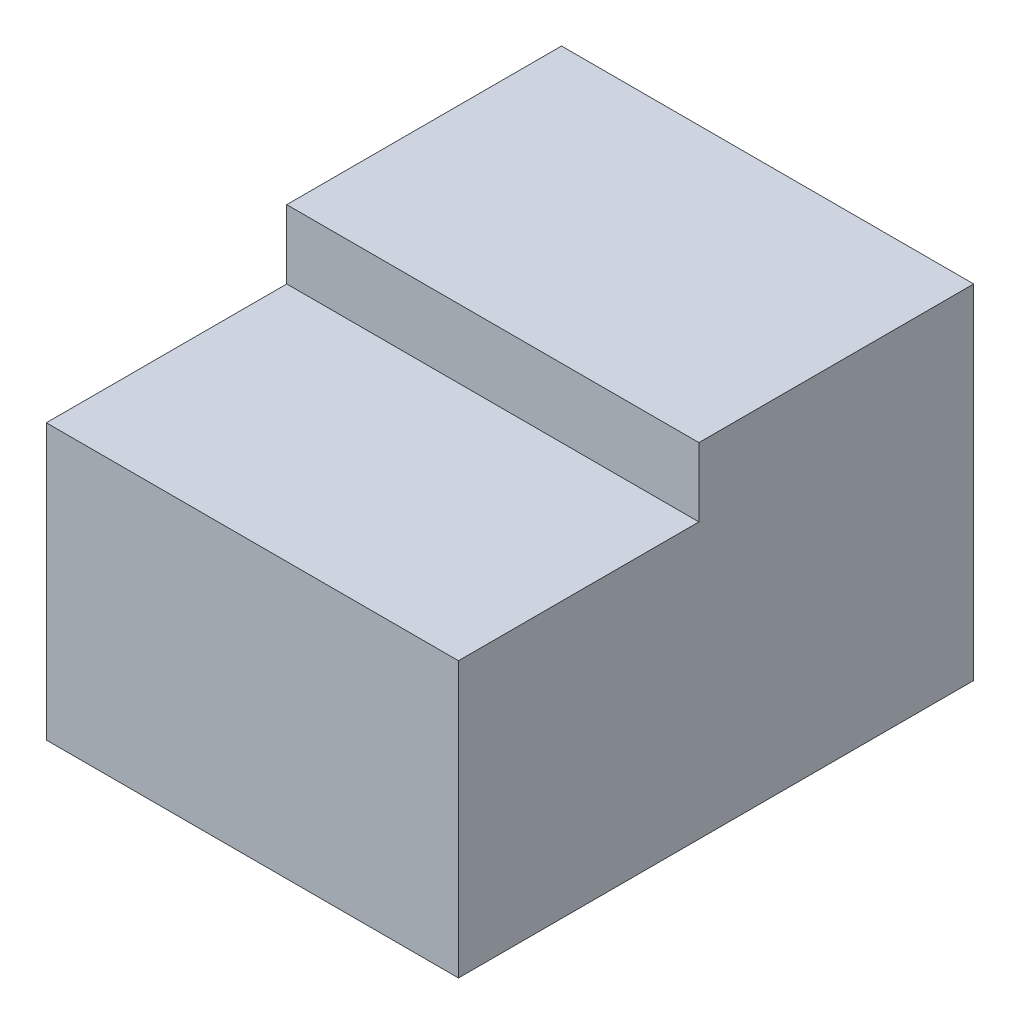
ISO-10303-21;
HEADER;
FILE_DESCRIPTION(('STEP AP214'),'2;1');
FILE_NAME('part.step','',(''),(''),'','','');
FILE_SCHEMA(('AUTOMOTIVE_DESIGN { 1 0 10303 214 1 1 1 1 }'));
ENDSEC;
DATA;
#1=APPLICATION_CONTEXT('core data for automotive mechanical design processes');
#2=APPLICATION_PROTOCOL_DEFINITION('international standard','automotive_design',2000,#1);
#3=PRODUCT_CONTEXT('',#1,'mechanical');
#4=PRODUCT('Part','Part','',(#3));
#5=PRODUCT_RELATED_PRODUCT_CATEGORY('part','',(#4));
#6=PRODUCT_DEFINITION_FORMATION('','',#4);
#7=PRODUCT_DEFINITION_CONTEXT('part definition',#1,'design');
#8=PRODUCT_DEFINITION('design','',#6,#7);
#9=PRODUCT_DEFINITION_SHAPE('','',#8);
#10=(LENGTH_UNIT() NAMED_UNIT(*) SI_UNIT(.MILLI.,.METRE.));
#11=(NAMED_UNIT(*) PLANE_ANGLE_UNIT() SI_UNIT($,.RADIAN.));
#12=(NAMED_UNIT(*) SI_UNIT($,.STERADIAN.) SOLID_ANGLE_UNIT());
#13=UNCERTAINTY_MEASURE_WITH_UNIT(LENGTH_MEASURE(1.E-05),#10,'distance_accuracy_value','');
#14=(GEOMETRIC_REPRESENTATION_CONTEXT(3) GLOBAL_UNCERTAINTY_ASSIGNED_CONTEXT((#13)) GLOBAL_UNIT_ASSIGNED_CONTEXT((#10,
#11,#12)) REPRESENTATION_CONTEXT('',''));
#15=CARTESIAN_POINT('',(0.,0.,0.));
#16=DIRECTION('',(0.,0.,1.));
#17=DIRECTION('',(1.,0.,0.));
#18=AXIS2_PLACEMENT_3D('',#15,#16,#17);
#19=CARTESIAN_POINT('',(12.,10.,0.));
#20=DIRECTION('',(0.,0.,-1.));
#21=DIRECTION('',(0.,1.,0.));
#22=AXIS2_PLACEMENT_3D('',#19,#20,#21);
#23=PLANE('',#22);
#24=DIRECTION('',(-0.5,-0.866025403784438,0.));
#25=VECTOR('',#24,1.);
#26=CARTESIAN_POINT('',(10.618802153517,5.,0.));
#27=LINE('',#26,#25);
#28=CARTESIAN_POINT('',(10.618802153517,5.,0.));
#29=VERTEX_POINT('',#28);
#30=CARTESIAN_POINT('',(8.3094010767585,1.,0.));
#31=VERTEX_POINT('',#30);
#32=EDGE_CURVE('E57',#29,#31,#27,.T.);
#33=ORIENTED_EDGE('',*,*,#32,.F.);
#34=DIRECTION('',(0.5,-0.866025403784439,0.));
#35=VECTOR('',#34,1.);
#36=CARTESIAN_POINT('',(8.3094010767585,9.,0.));
#37=LINE('',#36,#35);
#38=CARTESIAN_POINT('',(8.3094010767585,9.,0.));
#39=VERTEX_POINT('',#38);
#40=EDGE_CURVE('E216',#39,#29,#37,.T.);
#41=ORIENTED_EDGE('',*,*,#40,.F.);
#42=DIRECTION('',(1.,0.,0.));
#43=VECTOR('',#42,1.);
#44=CARTESIAN_POINT('',(3.6905989232415,9.,0.));
#45=LINE('',#44,#43);
#46=CARTESIAN_POINT('',(3.6905989232415,9.,0.));
#47=VERTEX_POINT('',#46);
#48=EDGE_CURVE('E242',#47,#39,#45,.T.);
#49=ORIENTED_EDGE('',*,*,#48,.F.);
#50=DIRECTION('',(0.5,0.866025403784439,0.));
#51=VECTOR('',#50,1.);
#52=CARTESIAN_POINT('',(1.38119784648299,5.,0.));
#53=LINE('',#52,#51);
#54=CARTESIAN_POINT('',(1.38119784648299,5.,0.));
#55=VERTEX_POINT('',#54);
#56=EDGE_CURVE('E239',#55,#47,#53,.T.);
#57=ORIENTED_EDGE('',*,*,#56,.F.);
#58=DIRECTION('',(-0.5,0.866025403784439,0.));
#59=VECTOR('',#58,1.);
#60=CARTESIAN_POINT('',(3.6905989232415,1.,0.));
#61=LINE('',#60,#59);
#62=CARTESIAN_POINT('',(3.6905989232415,1.,0.));
#63=VERTEX_POINT('',#62);
#64=EDGE_CURVE('E236',#63,#55,#61,.T.);
#65=ORIENTED_EDGE('',*,*,#64,.F.);
#66=DIRECTION('',(-1.,0.,0.));
#67=VECTOR('',#66,1.);
#68=CARTESIAN_POINT('',(8.3094010767585,1.,0.));
#69=LINE('',#68,#67);
#70=EDGE_CURVE('E233',#31,#63,#69,.T.);
#71=ORIENTED_EDGE('',*,*,#70,.F.);
#72=EDGE_LOOP('',(#33,#41,#49,#57,#65,#71));
#73=FACE_BOUND('',#72,.T.);
#74=DIRECTION('',(0.,-1.,0.));
#75=VECTOR('',#74,1.);
#76=CARTESIAN_POINT('',(0.,10.,0.));
#77=LINE('',#76,#75);
#78=CARTESIAN_POINT('',(0.,10.,0.));
#79=VERTEX_POINT('',#78);
#80=CARTESIAN_POINT('',(0.,0.,0.));
#81=VERTEX_POINT('',#80);
#82=EDGE_CURVE('E249',#79,#81,#77,.T.);
#83=ORIENTED_EDGE('',*,*,#82,.F.);
#84=DIRECTION('',(-1.,0.,0.));
#85=VECTOR('',#84,1.);
#86=CARTESIAN_POINT('',(12.,10.,0.));
#87=LINE('',#86,#85);
#88=CARTESIAN_POINT('',(12.,10.,0.));
#89=VERTEX_POINT('',#88);
#90=EDGE_CURVE('E11',#89,#79,#87,.T.);
#91=ORIENTED_EDGE('',*,*,#90,.F.);
#92=DIRECTION('',(0.,-1.,0.));
#93=VECTOR('',#92,1.);
#94=CARTESIAN_POINT('',(12.,10.,0.));
#95=LINE('',#94,#93);
#96=CARTESIAN_POINT('',(12.,0.,0.));
#97=VERTEX_POINT('',#96);
#98=EDGE_CURVE('E259',#89,#97,#95,.T.);
#99=ORIENTED_EDGE('',*,*,#98,.T.);
#100=DIRECTION('',(-1.,0.,0.));
#101=VECTOR('',#100,1.);
#102=CARTESIAN_POINT('',(12.,0.,0.));
#103=LINE('',#102,#101);
#104=EDGE_CURVE('E36',#97,#81,#103,.T.);
#105=ORIENTED_EDGE('',*,*,#104,.T.);
#106=EDGE_LOOP('',(#83,#91,#99,#105));
#107=FACE_BOUND('',#106,.T.);
#108=ADVANCED_FACE('F33',(#73,#107),#23,.T.);
#109=CARTESIAN_POINT('',(12.,10.,8.));
#110=DIRECTION('',(0.,1.,0.));
#111=DIRECTION('',(0.,0.,1.));
#112=AXIS2_PLACEMENT_3D('',#109,#110,#111);
#113=PLANE('',#112);
#114=DIRECTION('',(0.,0.,-1.));
#115=VECTOR('',#114,1.);
#116=CARTESIAN_POINT('',(0.,10.,8.));
#117=LINE('',#116,#115);
#118=CARTESIAN_POINT('',(0.,10.,8.));
#119=VERTEX_POINT('',#118);
#120=EDGE_CURVE('E263',#119,#79,#117,.T.);
#121=ORIENTED_EDGE('',*,*,#120,.F.);
#122=DIRECTION('',(-1.,0.,0.));
#123=VECTOR('',#122,1.);
#124=CARTESIAN_POINT('',(12.,10.,8.));
#125=LINE('',#124,#123);
#126=CARTESIAN_POINT('',(12.,10.,8.));
#127=VERTEX_POINT('',#126);
#128=EDGE_CURVE('E41',#127,#119,#125,.T.);
#129=ORIENTED_EDGE('',*,*,#128,.F.);
#130=DIRECTION('',(0.,0.,-1.));
#131=VECTOR('',#130,1.);
#132=CARTESIAN_POINT('',(12.,10.,8.));
#133=LINE('',#132,#131);
#134=EDGE_CURVE('E275',#127,#89,#133,.T.);
#135=ORIENTED_EDGE('',*,*,#134,.T.);
#136=ORIENTED_EDGE('',*,*,#90,.T.);
#137=EDGE_LOOP('',(#121,#129,#135,#136));
#138=FACE_BOUND('',#137,.T.);
#139=ADVANCED_FACE('F312',(#138),#113,.T.);
#140=CARTESIAN_POINT('',(12.,8.,8.));
#141=DIRECTION('',(0.,0.,1.));
#142=DIRECTION('',(1.,0.,0.));
#143=AXIS2_PLACEMENT_3D('',#140,#141,#142);
#144=PLANE('',#143);
#145=DIRECTION('',(0.,1.,0.));
#146=VECTOR('',#145,1.);
#147=CARTESIAN_POINT('',(0.,8.,8.));
#148=LINE('',#147,#146);
#149=CARTESIAN_POINT('',(0.,8.,8.));
#150=VERTEX_POINT('',#149);
#151=EDGE_CURVE('E289',#150,#119,#148,.T.);
#152=ORIENTED_EDGE('',*,*,#151,.F.);
#153=DIRECTION('',(-1.,0.,0.));
#154=VECTOR('',#153,1.);
#155=CARTESIAN_POINT('',(12.,8.,8.));
#156=LINE('',#155,#154);
#157=CARTESIAN_POINT('',(12.,8.,8.));
#158=VERTEX_POINT('',#157);
#159=EDGE_CURVE('E295',#158,#150,#156,.T.);
#160=ORIENTED_EDGE('',*,*,#159,.F.);
#161=DIRECTION('',(0.,1.,0.));
#162=VECTOR('',#161,1.);
#163=CARTESIAN_POINT('',(12.,8.,8.));
#164=LINE('',#163,#162);
#165=EDGE_CURVE('E272',#158,#127,#164,.T.);
#166=ORIENTED_EDGE('',*,*,#165,.T.);
#167=ORIENTED_EDGE('',*,*,#128,.T.);
#168=EDGE_LOOP('',(#152,#160,#166,#167));
#169=FACE_BOUND('',#168,.T.);
#170=ADVANCED_FACE('F325',(#169),#144,.T.);
#171=CARTESIAN_POINT('',(12.,8.,15.));
#172=DIRECTION('',(0.,1.,0.));
#173=DIRECTION('',(0.,0.,1.));
#174=AXIS2_PLACEMENT_3D('',#171,#172,#173);
#175=PLANE('',#174);
#176=DIRECTION('',(0.,0.,-1.));
#177=VECTOR('',#176,1.);
#178=CARTESIAN_POINT('',(0.,8.,15.));
#179=LINE('',#178,#177);
#180=CARTESIAN_POINT('',(0.,8.,15.));
#181=VERTEX_POINT('',#180);
#182=EDGE_CURVE('E286',#181,#150,#179,.T.);
#183=ORIENTED_EDGE('',*,*,#182,.F.);
#184=DIRECTION('',(-1.,0.,0.));
#185=VECTOR('',#184,1.);
#186=CARTESIAN_POINT('',(12.,8.,15.));
#187=LINE('',#186,#185);
#188=CARTESIAN_POINT('',(12.,8.,15.));
#189=VERTEX_POINT('',#188);
#190=EDGE_CURVE('E297',#189,#181,#187,.T.);
#191=ORIENTED_EDGE('',*,*,#190,.F.);
#192=DIRECTION('',(0.,0.,-1.));
#193=VECTOR('',#192,1.);
#194=CARTESIAN_POINT('',(12.,8.,15.));
#195=LINE('',#194,#193);
#196=EDGE_CURVE('E269',#189,#158,#195,.T.);
#197=ORIENTED_EDGE('',*,*,#196,.T.);
#198=ORIENTED_EDGE('',*,*,#159,.T.);
#199=EDGE_LOOP('',(#183,#191,#197,#198));
#200=FACE_BOUND('',#199,.T.);
#201=ADVANCED_FACE('F323',(#200),#175,.T.);
#202=CARTESIAN_POINT('',(12.,0.,15.));
#203=DIRECTION('',(0.,0.,1.));
#204=DIRECTION('',(1.,0.,0.));
#205=AXIS2_PLACEMENT_3D('',#202,#203,#204);
#206=PLANE('',#205);
#207=DIRECTION('',(0.,1.,0.));
#208=VECTOR('',#207,1.);
#209=CARTESIAN_POINT('',(0.,0.,15.));
#210=LINE('',#209,#208);
#211=CARTESIAN_POINT('',(0.,0.,15.));
#212=VERTEX_POINT('',#211);
#213=EDGE_CURVE('E283',#212,#181,#210,.T.);
#214=ORIENTED_EDGE('',*,*,#213,.F.);
#215=DIRECTION('',(-1.,0.,0.));
#216=VECTOR('',#215,1.);
#217=CARTESIAN_POINT('',(12.,0.,15.));
#218=LINE('',#217,#216);
#219=CARTESIAN_POINT('',(12.,0.,15.));
#220=VERTEX_POINT('',#219);
#221=EDGE_CURVE('E298',#220,#212,#218,.T.);
#222=ORIENTED_EDGE('',*,*,#221,.F.);
#223=DIRECTION('',(0.,1.,0.));
#224=VECTOR('',#223,1.);
#225=CARTESIAN_POINT('',(12.,0.,15.));
#226=LINE('',#225,#224);
#227=EDGE_CURVE('E266',#220,#189,#226,.T.);
#228=ORIENTED_EDGE('',*,*,#227,.T.);
#229=ORIENTED_EDGE('',*,*,#190,.T.);
#230=EDGE_LOOP('',(#214,#222,#228,#229));
#231=FACE_BOUND('',#230,.T.);
#232=ADVANCED_FACE('F320',(#231),#206,.T.);
#233=CARTESIAN_POINT('',(12.,0.,0.));
#234=DIRECTION('',(0.,-1.,0.));
#235=DIRECTION('',(0.,0.,-1.));
#236=AXIS2_PLACEMENT_3D('',#233,#234,#235);
#237=PLANE('',#236);
#238=DIRECTION('',(-0.5,0.,-0.866025403784438));
#239=VECTOR('',#238,1.);
#240=CARTESIAN_POINT('',(3.6905989232415,0.,14.));
#241=LINE('',#240,#239);
#242=CARTESIAN_POINT('',(3.6905989232415,0.,14.));
#243=VERTEX_POINT('',#242);
#244=CARTESIAN_POINT('',(1.38119784648299,0.,10.));
#245=VERTEX_POINT('',#244);
#246=EDGE_CURVE('E49',#243,#245,#241,.T.);
#247=ORIENTED_EDGE('',*,*,#246,.F.);
#248=DIRECTION('',(-1.,0.,0.));
#249=VECTOR('',#248,1.);
#250=CARTESIAN_POINT('',(8.3094010767585,0.,14.));
#251=LINE('',#250,#249);
#252=CARTESIAN_POINT('',(8.3094010767585,0.,14.));
#253=VERTEX_POINT('',#252);
#254=EDGE_CURVE('E179',#253,#243,#251,.T.);
#255=ORIENTED_EDGE('',*,*,#254,.F.);
#256=DIRECTION('',(-0.5,0.,0.866025403784438));
#257=VECTOR('',#256,1.);
#258=CARTESIAN_POINT('',(10.618802153517,0.,10.));
#259=LINE('',#258,#257);
#260=CARTESIAN_POINT('',(10.618802153517,0.,10.));
#261=VERTEX_POINT('',#260);
#262=EDGE_CURVE('E182',#261,#253,#259,.T.);
#263=ORIENTED_EDGE('',*,*,#262,.F.);
#264=DIRECTION('',(0.5,0.,0.866025403784438));
#265=VECTOR('',#264,1.);
#266=CARTESIAN_POINT('',(8.3094010767585,0.,6.));
#267=LINE('',#266,#265);
#268=CARTESIAN_POINT('',(8.3094010767585,0.,6.));
#269=VERTEX_POINT('',#268);
#270=EDGE_CURVE('E198',#269,#261,#267,.T.);
#271=ORIENTED_EDGE('',*,*,#270,.F.);
#272=DIRECTION('',(1.,0.,0.));
#273=VECTOR('',#272,1.);
#274=CARTESIAN_POINT('',(3.6905989232415,0.,6.));
#275=LINE('',#274,#273);
#276=CARTESIAN_POINT('',(3.6905989232415,0.,6.));
#277=VERTEX_POINT('',#276);
#278=EDGE_CURVE('E195',#277,#269,#275,.T.);
#279=ORIENTED_EDGE('',*,*,#278,.F.);
#280=DIRECTION('',(0.500000000000001,0.,-0.866025403784438));
#281=VECTOR('',#280,1.);
#282=CARTESIAN_POINT('',(1.38119784648299,0.,10.));
#283=LINE('',#282,#281);
#284=EDGE_CURVE('E193',#245,#277,#283,.T.);
#285=ORIENTED_EDGE('',*,*,#284,.F.);
#286=EDGE_LOOP('',(#247,#255,#263,#271,#279,#285));
#287=FACE_BOUND('',#286,.T.);
#288=DIRECTION('',(0.,0.,1.));
#289=VECTOR('',#288,1.);
#290=CARTESIAN_POINT('',(0.,0.,0.));
#291=LINE('',#290,#289);
#292=EDGE_CURVE('E280',#81,#212,#291,.T.);
#293=ORIENTED_EDGE('',*,*,#292,.F.);
#294=ORIENTED_EDGE('',*,*,#104,.F.);
#295=DIRECTION('',(0.,0.,1.));
#296=VECTOR('',#295,1.);
#297=CARTESIAN_POINT('',(12.,0.,0.));
#298=LINE('',#297,#296);
#299=EDGE_CURVE('E262',#97,#220,#298,.T.);
#300=ORIENTED_EDGE('',*,*,#299,.T.);
#301=ORIENTED_EDGE('',*,*,#221,.T.);
#302=EDGE_LOOP('',(#293,#294,#300,#301));
#303=FACE_BOUND('',#302,.T.);
#304=ADVANCED_FACE('F306',(#287,#303),#237,.T.);
#305=CARTESIAN_POINT('',(12.,0.,0.));
#306=DIRECTION('',(-1.,0.,0.));
#307=DIRECTION('',(0.,0.,1.));
#308=AXIS2_PLACEMENT_3D('',#305,#306,#307);
#309=PLANE('',#308);
#310=ORIENTED_EDGE('',*,*,#98,.F.);
#311=ORIENTED_EDGE('',*,*,#134,.F.);
#312=ORIENTED_EDGE('',*,*,#165,.F.);
#313=ORIENTED_EDGE('',*,*,#196,.F.);
#314=ORIENTED_EDGE('',*,*,#227,.F.);
#315=ORIENTED_EDGE('',*,*,#299,.F.);
#316=EDGE_LOOP('',(#310,#311,#312,#313,#314,#315));
#317=FACE_BOUND('',#316,.T.);
#318=ADVANCED_FACE('F315',(#317),#309,.F.);
#319=CARTESIAN_POINT('',(0.,0.,0.));
#320=DIRECTION('',(-1.,0.,0.));
#321=DIRECTION('',(0.,0.,1.));
#322=AXIS2_PLACEMENT_3D('',#319,#320,#321);
#323=PLANE('',#322);
#324=ORIENTED_EDGE('',*,*,#82,.T.);
#325=ORIENTED_EDGE('',*,*,#292,.T.);
#326=ORIENTED_EDGE('',*,*,#213,.T.);
#327=ORIENTED_EDGE('',*,*,#182,.T.);
#328=ORIENTED_EDGE('',*,*,#151,.T.);
#329=ORIENTED_EDGE('',*,*,#120,.T.);
#330=EDGE_LOOP('',(#324,#325,#326,#327,#328,#329));
#331=FACE_BOUND('',#330,.T.);
#332=ADVANCED_FACE('F308',(#331),#323,.T.);
#333=CARTESIAN_POINT('',(10.618802153517,5.,5.));
#334=DIRECTION('',(0.866025403784438,-0.5,0.));
#335=DIRECTION('',(0.5,0.866025403784438,0.));
#336=AXIS2_PLACEMENT_3D('',#333,#334,#335);
#337=PLANE('',#336);
#338=ORIENTED_EDGE('',*,*,#32,.T.);
#339=DIRECTION('',(0.,0.,-1.));
#340=VECTOR('',#339,1.);
#341=CARTESIAN_POINT('',(8.3094010767585,1.,5.));
#342=LINE('',#341,#340);
#343=CARTESIAN_POINT('',(8.3094010767585,1.,5.));
#344=VERTEX_POINT('',#343);
#345=EDGE_CURVE('E231',#344,#31,#342,.T.);
#346=ORIENTED_EDGE('',*,*,#345,.F.);
#347=DIRECTION('',(-0.5,-0.866025403784438,0.));
#348=VECTOR('',#347,1.);
#349=CARTESIAN_POINT('',(10.618802153517,5.,5.));
#350=LINE('',#349,#348);
#351=CARTESIAN_POINT('',(10.618802153517,5.,5.));
#352=VERTEX_POINT('',#351);
#353=EDGE_CURVE('E212',#352,#344,#350,.T.);
#354=ORIENTED_EDGE('',*,*,#353,.F.);
#355=DIRECTION('',(0.,0.,-1.));
#356=VECTOR('',#355,1.);
#357=CARTESIAN_POINT('',(10.618802153517,5.,5.));
#358=LINE('',#357,#356);
#359=EDGE_CURVE('E247',#352,#29,#358,.T.);
#360=ORIENTED_EDGE('',*,*,#359,.T.);
#361=EDGE_LOOP('',(#338,#346,#354,#360));
#362=FACE_BOUND('',#361,.T.);
#363=ADVANCED_FACE('F348',(#362),#337,.F.);
#364=CARTESIAN_POINT('',(8.3094010767585,9.,5.));
#365=DIRECTION('',(0.866025403784439,0.5,0.));
#366=DIRECTION('',(-0.5,0.866025403784439,0.));
#367=AXIS2_PLACEMENT_3D('',#364,#365,#366);
#368=PLANE('',#367);
#369=ORIENTED_EDGE('',*,*,#40,.T.);
#370=ORIENTED_EDGE('',*,*,#359,.F.);
#371=DIRECTION('',(0.5,-0.866025403784439,0.));
#372=VECTOR('',#371,1.);
#373=CARTESIAN_POINT('',(8.3094010767585,9.,5.));
#374=LINE('',#373,#372);
#375=CARTESIAN_POINT('',(8.3094010767585,9.,5.));
#376=VERTEX_POINT('',#375);
#377=EDGE_CURVE('E228',#376,#352,#374,.T.);
#378=ORIENTED_EDGE('',*,*,#377,.F.);
#379=DIRECTION('',(0.,0.,-1.));
#380=VECTOR('',#379,1.);
#381=CARTESIAN_POINT('',(8.3094010767585,9.,5.));
#382=LINE('',#381,#380);
#383=EDGE_CURVE('E250',#376,#39,#382,.T.);
#384=ORIENTED_EDGE('',*,*,#383,.T.);
#385=EDGE_LOOP('',(#369,#370,#378,#384));
#386=FACE_BOUND('',#385,.T.);
#387=ADVANCED_FACE('F354',(#386),#368,.F.);
#388=CARTESIAN_POINT('',(3.6905989232415,9.,5.));
#389=DIRECTION('',(0.,1.,0.));
#390=DIRECTION('',(0.,0.,1.));
#391=AXIS2_PLACEMENT_3D('',#388,#389,#390);
#392=PLANE('',#391);
#393=ORIENTED_EDGE('',*,*,#48,.T.);
#394=ORIENTED_EDGE('',*,*,#383,.F.);
#395=DIRECTION('',(1.,0.,0.));
#396=VECTOR('',#395,1.);
#397=CARTESIAN_POINT('',(3.6905989232415,9.,5.));
#398=LINE('',#397,#396);
#399=CARTESIAN_POINT('',(3.6905989232415,9.,5.));
#400=VERTEX_POINT('',#399);
#401=EDGE_CURVE('E225',#400,#376,#398,.T.);
#402=ORIENTED_EDGE('',*,*,#401,.F.);
#403=DIRECTION('',(0.,0.,-1.));
#404=VECTOR('',#403,1.);
#405=CARTESIAN_POINT('',(3.6905989232415,9.,5.));
#406=LINE('',#405,#404);
#407=EDGE_CURVE('E252',#400,#47,#406,.T.);
#408=ORIENTED_EDGE('',*,*,#407,.T.);
#409=EDGE_LOOP('',(#393,#394,#402,#408));
#410=FACE_BOUND('',#409,.T.);
#411=ADVANCED_FACE('F356',(#410),#392,.F.);
#412=CARTESIAN_POINT('',(1.38119784648299,5.,5.));
#413=DIRECTION('',(-0.866025403784439,0.5,0.));
#414=DIRECTION('',(-0.5,-0.866025403784439,0.));
#415=AXIS2_PLACEMENT_3D('',#412,#413,#414);
#416=PLANE('',#415);
#417=ORIENTED_EDGE('',*,*,#56,.T.);
#418=ORIENTED_EDGE('',*,*,#407,.F.);
#419=DIRECTION('',(0.5,0.866025403784439,0.));
#420=VECTOR('',#419,1.);
#421=CARTESIAN_POINT('',(1.38119784648299,5.,5.));
#422=LINE('',#421,#420);
#423=CARTESIAN_POINT('',(1.38119784648299,5.,5.));
#424=VERTEX_POINT('',#423);
#425=EDGE_CURVE('E222',#424,#400,#422,.T.);
#426=ORIENTED_EDGE('',*,*,#425,.F.);
#427=DIRECTION('',(0.,0.,-1.));
#428=VECTOR('',#427,1.);
#429=CARTESIAN_POINT('',(1.38119784648299,5.,5.));
#430=LINE('',#429,#428);
#431=EDGE_CURVE('E254',#424,#55,#430,.T.);
#432=ORIENTED_EDGE('',*,*,#431,.T.);
#433=EDGE_LOOP('',(#417,#418,#426,#432));
#434=FACE_BOUND('',#433,.T.);
#435=ADVANCED_FACE('F358',(#434),#416,.F.);
#436=CARTESIAN_POINT('',(3.6905989232415,1.,5.));
#437=DIRECTION('',(-0.866025403784439,-0.5,0.));
#438=DIRECTION('',(0.5,-0.866025403784439,0.));
#439=AXIS2_PLACEMENT_3D('',#436,#437,#438);
#440=PLANE('',#439);
#441=ORIENTED_EDGE('',*,*,#64,.T.);
#442=ORIENTED_EDGE('',*,*,#431,.F.);
#443=DIRECTION('',(-0.5,0.866025403784439,0.));
#444=VECTOR('',#443,1.);
#445=CARTESIAN_POINT('',(3.6905989232415,1.,5.));
#446=LINE('',#445,#444);
#447=CARTESIAN_POINT('',(3.6905989232415,1.,5.));
#448=VERTEX_POINT('',#447);
#449=EDGE_CURVE('E219',#448,#424,#446,.T.);
#450=ORIENTED_EDGE('',*,*,#449,.F.);
#451=DIRECTION('',(0.,0.,-1.));
#452=VECTOR('',#451,1.);
#453=CARTESIAN_POINT('',(3.6905989232415,1.,5.));
#454=LINE('',#453,#452);
#455=EDGE_CURVE('E256',#448,#63,#454,.T.);
#456=ORIENTED_EDGE('',*,*,#455,.T.);
#457=EDGE_LOOP('',(#441,#442,#450,#456));
#458=FACE_BOUND('',#457,.T.);
#459=ADVANCED_FACE('F361',(#458),#440,.F.);
#460=CARTESIAN_POINT('',(8.3094010767585,1.,5.));
#461=DIRECTION('',(0.,-1.,0.));
#462=DIRECTION('',(0.,0.,-1.));
#463=AXIS2_PLACEMENT_3D('',#460,#461,#462);
#464=PLANE('',#463);
#465=ORIENTED_EDGE('',*,*,#70,.T.);
#466=ORIENTED_EDGE('',*,*,#455,.F.);
#467=DIRECTION('',(-1.,0.,0.));
#468=VECTOR('',#467,1.);
#469=CARTESIAN_POINT('',(8.3094010767585,1.,5.));
#470=LINE('',#469,#468);
#471=EDGE_CURVE('E215',#344,#448,#470,.T.);
#472=ORIENTED_EDGE('',*,*,#471,.F.);
#473=ORIENTED_EDGE('',*,*,#345,.T.);
#474=EDGE_LOOP('',(#465,#466,#472,#473));
#475=FACE_BOUND('',#474,.T.);
#476=ADVANCED_FACE('F344',(#475),#464,.F.);
#477=CARTESIAN_POINT('',(0.,0.,5.));
#478=DIRECTION('',(0.,0.,-1.));
#479=DIRECTION('',(0.,1.,0.));
#480=AXIS2_PLACEMENT_3D('',#477,#478,#479);
#481=PLANE('',#480);
#482=ORIENTED_EDGE('',*,*,#353,.T.);
#483=ORIENTED_EDGE('',*,*,#471,.T.);
#484=ORIENTED_EDGE('',*,*,#449,.T.);
#485=ORIENTED_EDGE('',*,*,#425,.T.);
#486=ORIENTED_EDGE('',*,*,#401,.T.);
#487=ORIENTED_EDGE('',*,*,#377,.T.);
#488=EDGE_LOOP('',(#482,#483,#484,#485,#486,#487));
#489=FACE_BOUND('',#488,.T.);
#490=ADVANCED_FACE('F351',(#489),#481,.T.);
#491=CARTESIAN_POINT('',(3.6905989232415,5.,14.));
#492=DIRECTION('',(-0.866025403784439,0.,0.5));
#493=DIRECTION('',(0.5,0.,0.866025403784439));
#494=AXIS2_PLACEMENT_3D('',#491,#492,#493);
#495=PLANE('',#494);
#496=ORIENTED_EDGE('',*,*,#246,.T.);
#497=DIRECTION('',(0.,-1.,0.));
#498=VECTOR('',#497,1.);
#499=CARTESIAN_POINT('',(1.38119784648299,5.,10.));
#500=LINE('',#499,#498);
#501=CARTESIAN_POINT('',(1.38119784648299,5.,10.));
#502=VERTEX_POINT('',#501);
#503=EDGE_CURVE('E156',#502,#245,#500,.T.);
#504=ORIENTED_EDGE('',*,*,#503,.F.);
#505=DIRECTION('',(-0.5,0.,-0.866025403784438));
#506=VECTOR('',#505,1.);
#507=CARTESIAN_POINT('',(3.6905989232415,5.,14.));
#508=LINE('',#507,#506);
#509=CARTESIAN_POINT('',(3.6905989232415,5.,14.));
#510=VERTEX_POINT('',#509);
#511=EDGE_CURVE('E160',#510,#502,#508,.T.);
#512=ORIENTED_EDGE('',*,*,#511,.F.);
#513=DIRECTION('',(0.,-1.,0.));
#514=VECTOR('',#513,1.);
#515=CARTESIAN_POINT('',(3.6905989232415,5.,14.));
#516=LINE('',#515,#514);
#517=EDGE_CURVE('E203',#510,#243,#516,.T.);
#518=ORIENTED_EDGE('',*,*,#517,.T.);
#519=EDGE_LOOP('',(#496,#504,#512,#518));
#520=FACE_BOUND('',#519,.T.);
#521=ADVANCED_FACE('F158',(#520),#495,.F.);
#522=CARTESIAN_POINT('',(8.3094010767585,5.,14.));
#523=DIRECTION('',(0.,0.,1.));
#524=DIRECTION('',(1.,0.,0.));
#525=AXIS2_PLACEMENT_3D('',#522,#523,#524);
#526=PLANE('',#525);
#527=ORIENTED_EDGE('',*,*,#254,.T.);
#528=ORIENTED_EDGE('',*,*,#517,.F.);
#529=DIRECTION('',(-1.,0.,0.));
#530=VECTOR('',#529,1.);
#531=CARTESIAN_POINT('',(8.3094010767585,5.,14.));
#532=LINE('',#531,#530);
#533=CARTESIAN_POINT('',(8.3094010767585,5.,14.));
#534=VERTEX_POINT('',#533);
#535=EDGE_CURVE('E166',#534,#510,#532,.T.);
#536=ORIENTED_EDGE('',*,*,#535,.F.);
#537=DIRECTION('',(0.,-1.,0.));
#538=VECTOR('',#537,1.);
#539=CARTESIAN_POINT('',(8.3094010767585,5.,14.));
#540=LINE('',#539,#538);
#541=EDGE_CURVE('E205',#534,#253,#540,.T.);
#542=ORIENTED_EDGE('',*,*,#541,.T.);
#543=EDGE_LOOP('',(#527,#528,#536,#542));
#544=FACE_BOUND('',#543,.T.);
#545=ADVANCED_FACE('F438',(#544),#526,.F.);
#546=CARTESIAN_POINT('',(10.618802153517,5.,10.));
#547=DIRECTION('',(0.866025403784438,0.,0.5));
#548=DIRECTION('',(0.5,0.,-0.866025403784438));
#549=AXIS2_PLACEMENT_3D('',#546,#547,#548);
#550=PLANE('',#549);
#551=ORIENTED_EDGE('',*,*,#262,.T.);
#552=ORIENTED_EDGE('',*,*,#541,.F.);
#553=DIRECTION('',(-0.5,0.,0.866025403784438));
#554=VECTOR('',#553,1.);
#555=CARTESIAN_POINT('',(10.618802153517,5.,10.));
#556=LINE('',#555,#554);
#557=CARTESIAN_POINT('',(10.618802153517,5.,10.));
#558=VERTEX_POINT('',#557);
#559=EDGE_CURVE('E189',#558,#534,#556,.T.);
#560=ORIENTED_EDGE('',*,*,#559,.F.);
#561=DIRECTION('',(0.,-1.,0.));
#562=VECTOR('',#561,1.);
#563=CARTESIAN_POINT('',(10.618802153517,5.,10.));
#564=LINE('',#563,#562);
#565=EDGE_CURVE('E207',#558,#261,#564,.T.);
#566=ORIENTED_EDGE('',*,*,#565,.T.);
#567=EDGE_LOOP('',(#551,#552,#560,#566));
#568=FACE_BOUND('',#567,.T.);
#569=ADVANCED_FACE('F447',(#568),#550,.F.);
#570=CARTESIAN_POINT('',(8.3094010767585,5.,6.));
#571=DIRECTION('',(0.866025403784438,0.,-0.5));
#572=DIRECTION('',(-0.5,0.,-0.866025403784438));
#573=AXIS2_PLACEMENT_3D('',#570,#571,#572);
#574=PLANE('',#573);
#575=ORIENTED_EDGE('',*,*,#270,.T.);
#576=ORIENTED_EDGE('',*,*,#565,.F.);
#577=DIRECTION('',(0.5,0.,0.866025403784438));
#578=VECTOR('',#577,1.);
#579=CARTESIAN_POINT('',(8.3094010767585,5.,6.));
#580=LINE('',#579,#578);
#581=CARTESIAN_POINT('',(8.3094010767585,5.,6.));
#582=VERTEX_POINT('',#581);
#583=EDGE_CURVE('E186',#582,#558,#580,.T.);
#584=ORIENTED_EDGE('',*,*,#583,.F.);
#585=DIRECTION('',(0.,-1.,0.));
#586=VECTOR('',#585,1.);
#587=CARTESIAN_POINT('',(8.3094010767585,5.,6.));
#588=LINE('',#587,#586);
#589=EDGE_CURVE('E209',#582,#269,#588,.T.);
#590=ORIENTED_EDGE('',*,*,#589,.T.);
#591=EDGE_LOOP('',(#575,#576,#584,#590));
#592=FACE_BOUND('',#591,.T.);
#593=ADVANCED_FACE('F457',(#592),#574,.F.);
#594=CARTESIAN_POINT('',(3.6905989232415,5.,6.));
#595=DIRECTION('',(0.,0.,-1.));
#596=DIRECTION('',(-1.,0.,0.));
#597=AXIS2_PLACEMENT_3D('',#594,#595,#596);
#598=PLANE('',#597);
#599=ORIENTED_EDGE('',*,*,#278,.T.);
#600=ORIENTED_EDGE('',*,*,#589,.F.);
#601=DIRECTION('',(1.,0.,0.));
#602=VECTOR('',#601,1.);
#603=CARTESIAN_POINT('',(3.6905989232415,5.,6.));
#604=LINE('',#603,#602);
#605=CARTESIAN_POINT('',(3.6905989232415,5.,6.));
#606=VERTEX_POINT('',#605);
#607=EDGE_CURVE('E174',#606,#582,#604,.T.);
#608=ORIENTED_EDGE('',*,*,#607,.F.);
#609=DIRECTION('',(0.,-1.,0.));
#610=VECTOR('',#609,1.);
#611=CARTESIAN_POINT('',(3.6905989232415,5.,6.));
#612=LINE('',#611,#610);
#613=EDGE_CURVE('E165',#606,#277,#612,.T.);
#614=ORIENTED_EDGE('',*,*,#613,.T.);
#615=EDGE_LOOP('',(#599,#600,#608,#614));
#616=FACE_BOUND('',#615,.T.);
#617=ADVANCED_FACE('F467',(#616),#598,.F.);
#618=CARTESIAN_POINT('',(1.38119784648299,5.,10.));
#619=DIRECTION('',(-0.866025403784438,0.,-0.500000000000001));
#620=DIRECTION('',(-0.500000000000001,0.,0.866025403784438));
#621=AXIS2_PLACEMENT_3D('',#618,#619,#620);
#622=PLANE('',#621);
#623=ORIENTED_EDGE('',*,*,#284,.T.);
#624=ORIENTED_EDGE('',*,*,#613,.F.);
#625=DIRECTION('',(0.500000000000001,0.,-0.866025403784438));
#626=VECTOR('',#625,1.);
#627=CARTESIAN_POINT('',(1.38119784648299,5.,10.));
#628=LINE('',#627,#626);
#629=EDGE_CURVE('E169',#502,#606,#628,.T.);
#630=ORIENTED_EDGE('',*,*,#629,.F.);
#631=ORIENTED_EDGE('',*,*,#503,.T.);
#632=EDGE_LOOP('',(#623,#624,#630,#631));
#633=FACE_BOUND('',#632,.T.);
#634=ADVANCED_FACE('F170',(#633),#622,.F.);
#635=CARTESIAN_POINT('',(0.,5.,0.));
#636=DIRECTION('',(0.,-1.,0.));
#637=DIRECTION('',(0.,0.,-1.));
#638=AXIS2_PLACEMENT_3D('',#635,#636,#637);
#639=PLANE('',#638);
#640=ORIENTED_EDGE('',*,*,#511,.T.);
#641=ORIENTED_EDGE('',*,*,#629,.T.);
#642=ORIENTED_EDGE('',*,*,#607,.T.);
#643=ORIENTED_EDGE('',*,*,#583,.T.);
#644=ORIENTED_EDGE('',*,*,#559,.T.);
#645=ORIENTED_EDGE('',*,*,#535,.T.);
#646=EDGE_LOOP('',(#640,#641,#642,#643,#644,#645));
#647=FACE_BOUND('',#646,.T.);
#648=ADVANCED_FACE('F176',(#647),#639,.T.);
#649=CLOSED_SHELL('',(#108,#139,#170,#201,#232,#304,#318,#332,#363,#387,#411,#435,#459,#476,
#490,#521,#545,#569,#593,#617,#634,#648));
#650=MANIFOLD_SOLID_BREP('B2',#649);
#651=ADVANCED_BREP_SHAPE_REPRESENTATION('',(#18,#650),#14);
#652=SHAPE_DEFINITION_REPRESENTATION(#9,#651);
ENDSEC;
END-ISO-10303-21;
